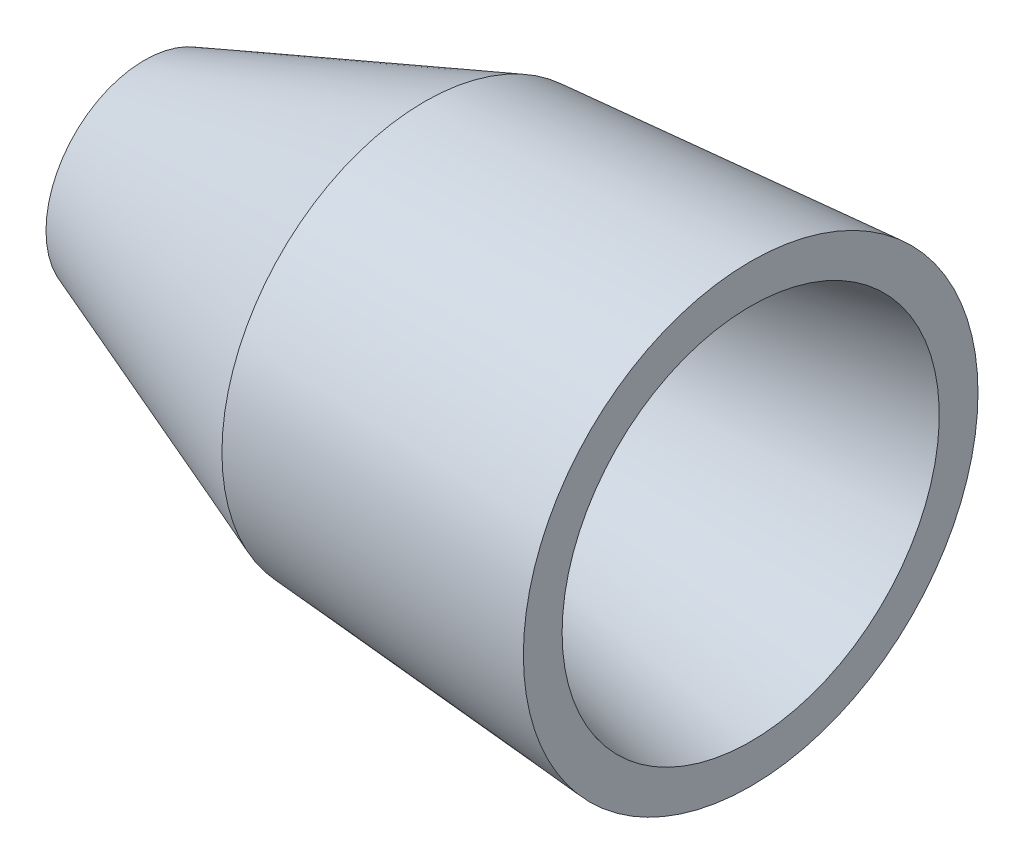
ISO-10303-21;
HEADER;
FILE_DESCRIPTION(('STEP AP214'),'2;1');
FILE_NAME('part.step','',(''),(''),'','','');
FILE_SCHEMA(('AUTOMOTIVE_DESIGN { 1 0 10303 214 1 1 1 1 }'));
ENDSEC;
DATA;
#1=APPLICATION_CONTEXT('core data for automotive mechanical design processes');
#2=APPLICATION_PROTOCOL_DEFINITION('international standard','automotive_design',2000,#1);
#3=PRODUCT_CONTEXT('',#1,'mechanical');
#4=PRODUCT('Part','Part','',(#3));
#5=PRODUCT_RELATED_PRODUCT_CATEGORY('part','',(#4));
#6=PRODUCT_DEFINITION_FORMATION('','',#4);
#7=PRODUCT_DEFINITION_CONTEXT('part definition',#1,'design');
#8=PRODUCT_DEFINITION('design','',#6,#7);
#9=PRODUCT_DEFINITION_SHAPE('','',#8);
#10=(LENGTH_UNIT() NAMED_UNIT(*) SI_UNIT(.MILLI.,.METRE.));
#11=(NAMED_UNIT(*) PLANE_ANGLE_UNIT() SI_UNIT($,.RADIAN.));
#12=(NAMED_UNIT(*) SI_UNIT($,.STERADIAN.) SOLID_ANGLE_UNIT());
#13=UNCERTAINTY_MEASURE_WITH_UNIT(LENGTH_MEASURE(1.E-05),#10,'distance_accuracy_value','');
#14=(GEOMETRIC_REPRESENTATION_CONTEXT(3) GLOBAL_UNCERTAINTY_ASSIGNED_CONTEXT((#13)) GLOBAL_UNIT_ASSIGNED_CONTEXT((#10,
#11,#12)) REPRESENTATION_CONTEXT('',''));
#15=CARTESIAN_POINT('',(0.,0.,0.));
#16=DIRECTION('',(0.,0.,1.));
#17=DIRECTION('',(1.,0.,0.));
#18=AXIS2_PLACEMENT_3D('',#15,#16,#17);
#19=CARTESIAN_POINT('',(0.,0.,0.));
#20=DIRECTION('',(1.,0.,0.));
#21=DIRECTION('',(0.,0.,-1.));
#22=AXIS2_PLACEMENT_3D('',#19,#20,#21);
#23=CONICAL_SURFACE('',#22,7.8883558173519,0.209385392953495);
#24=CARTESIAN_POINT('',(80.,0.,0.));
#25=DIRECTION('',(-1.,0.,0.));
#26=DIRECTION('',(0.,0.,1.));
#27=AXIS2_PLACEMENT_3D('',#24,#25,#26);
#28=CIRCLE('',#27,24.8883558173519);
#29=CARTESIAN_POINT('',(80.,0.,24.8883558173519));
#30=VERTEX_POINT('',#29);
#31=EDGE_CURVE('E55',#30,#30,#28,.T.);
#32=ORIENTED_EDGE('',*,*,#31,.F.);
#33=EDGE_LOOP('',(#32));
#34=FACE_BOUND('',#33,.T.);
#35=CARTESIAN_POINT('',(10.,0.,0.));
#36=DIRECTION('',(-1.,0.,0.));
#37=DIRECTION('',(0.,0.,1.));
#38=AXIS2_PLACEMENT_3D('',#35,#36,#37);
#39=CIRCLE('',#38,10.0133558173519);
#40=CARTESIAN_POINT('',(10.,0.,10.0133558173519));
#41=VERTEX_POINT('',#40);
#42=EDGE_CURVE('E10',#41,#41,#39,.F.);
#43=ORIENTED_EDGE('',*,*,#42,.F.);
#44=EDGE_LOOP('',(#43));
#45=FACE_BOUND('',#44,.T.);
#46=ADVANCED_FACE('F40',(#34,#45),#23,.F.);
#47=CARTESIAN_POINT('',(80.,0.,0.));
#48=DIRECTION('',(1.,0.,0.));
#49=DIRECTION('',(0.,0.,-1.));
#50=AXIS2_PLACEMENT_3D('',#47,#48,#49);
#51=CONICAL_SURFACE('',#50,30.,0.07540426942151);
#52=CARTESIAN_POINT('',(36.9685397326132,0.,0.));
#53=DIRECTION('',(-1.,0.,0.));
#54=DIRECTION('',(0.,0.,1.));
#55=AXIS2_PLACEMENT_3D('',#52,#53,#54);
#56=CIRCLE('',#55,26.7490804760661);
#57=CARTESIAN_POINT('',(36.9685397326132,0.,26.7490804760661));
#58=VERTEX_POINT('',#57);
#59=EDGE_CURVE('E42',#58,#58,#56,.T.);
#60=ORIENTED_EDGE('',*,*,#59,.F.);
#61=EDGE_LOOP('',(#60));
#62=FACE_BOUND('',#61,.T.);
#63=CARTESIAN_POINT('',(80.,0.,0.));
#64=DIRECTION('',(-1.,0.,0.));
#65=DIRECTION('',(0.,0.,1.));
#66=AXIS2_PLACEMENT_3D('',#63,#64,#65);
#67=CIRCLE('',#66,30.);
#68=CARTESIAN_POINT('',(80.,0.,30.));
#69=VERTEX_POINT('',#68);
#70=EDGE_CURVE('E60',#69,#69,#67,.T.);
#71=ORIENTED_EDGE('',*,*,#70,.T.);
#72=EDGE_LOOP('',(#71));
#73=FACE_BOUND('',#72,.T.);
#74=ADVANCED_FACE('F39',(#62,#73),#51,.T.);
#75=CARTESIAN_POINT('',(36.9685397326132,0.,0.));
#76=DIRECTION('',(1.,0.,0.));
#77=DIRECTION('',(0.,0.,-1.));
#78=AXIS2_PLACEMENT_3D('',#75,#76,#77);
#79=CONICAL_SURFACE('',#78,26.7490804760661,0.356061515415133);
#80=CARTESIAN_POINT('',(0.,0.,0.));
#81=DIRECTION('',(-1.,0.,0.));
#82=DIRECTION('',(0.,0.,1.));
#83=AXIS2_PLACEMENT_3D('',#80,#81,#82);
#84=CIRCLE('',#83,13.);
#85=CARTESIAN_POINT('',(0.,0.,13.));
#86=VERTEX_POINT('',#85);
#87=EDGE_CURVE('E48',#86,#86,#84,.T.);
#88=ORIENTED_EDGE('',*,*,#87,.F.);
#89=EDGE_LOOP('',(#88));
#90=FACE_BOUND('',#89,.T.);
#91=ORIENTED_EDGE('',*,*,#59,.T.);
#92=EDGE_LOOP('',(#91));
#93=FACE_BOUND('',#92,.T.);
#94=ADVANCED_FACE('F97',(#90,#93),#79,.T.);
#95=CARTESIAN_POINT('',(0.,13.,0.));
#96=DIRECTION('',(1.,0.,0.));
#97=DIRECTION('',(0.,0.,-1.));
#98=AXIS2_PLACEMENT_3D('',#95,#96,#97);
#99=PLANE('',#98);
#100=CARTESIAN_POINT('',(0.,8.,0.));
#101=DIRECTION('',(-1.,0.,0.));
#102=DIRECTION('',(0.,0.,1.));
#103=AXIS2_PLACEMENT_3D('',#100,#101,#102);
#104=CIRCLE('',#103,1.5);
#105=CARTESIAN_POINT('',(0.,8.,1.5));
#106=VERTEX_POINT('',#105);
#107=EDGE_CURVE('E80',#106,#106,#104,.T.);
#108=ORIENTED_EDGE('',*,*,#107,.F.);
#109=EDGE_LOOP('',(#108));
#110=FACE_BOUND('',#109,.T.);
#111=CARTESIAN_POINT('',(0.,-8.,0.));
#112=DIRECTION('',(-1.,0.,0.));
#113=DIRECTION('',(0.,0.,1.));
#114=AXIS2_PLACEMENT_3D('',#111,#112,#113);
#115=CIRCLE('',#114,1.5);
#116=CARTESIAN_POINT('',(0.,-8.,1.5));
#117=VERTEX_POINT('',#116);
#118=EDGE_CURVE('E78',#117,#117,#115,.T.);
#119=ORIENTED_EDGE('',*,*,#118,.F.);
#120=EDGE_LOOP('',(#119));
#121=FACE_BOUND('',#120,.T.);
#122=CARTESIAN_POINT('',(0.,0.,8.));
#123=DIRECTION('',(-1.,0.,0.));
#124=DIRECTION('',(0.,0.,1.));
#125=AXIS2_PLACEMENT_3D('',#122,#123,#124);
#126=CIRCLE('',#125,1.5);
#127=CARTESIAN_POINT('',(0.,0.,9.5));
#128=VERTEX_POINT('',#127);
#129=EDGE_CURVE('E67',#128,#128,#126,.T.);
#130=ORIENTED_EDGE('',*,*,#129,.F.);
#131=EDGE_LOOP('',(#130));
#132=FACE_BOUND('',#131,.T.);
#133=CARTESIAN_POINT('',(0.,0.,-8.));
#134=DIRECTION('',(-1.,0.,0.));
#135=DIRECTION('',(0.,0.,1.));
#136=AXIS2_PLACEMENT_3D('',#133,#134,#135);
#137=CIRCLE('',#136,1.5);
#138=CARTESIAN_POINT('',(0.,0.,-6.5));
#139=VERTEX_POINT('',#138);
#140=EDGE_CURVE('E65',#139,#139,#137,.T.);
#141=ORIENTED_EDGE('',*,*,#140,.F.);
#142=EDGE_LOOP('',(#141));
#143=FACE_BOUND('',#142,.T.);
#144=ORIENTED_EDGE('',*,*,#87,.T.);
#145=EDGE_LOOP('',(#144));
#146=FACE_BOUND('',#145,.T.);
#147=ADVANCED_FACE('F92',(#110,#121,#132,#143,#146),#99,.F.);
#148=CARTESIAN_POINT('',(80.,24.8883558173519,0.));
#149=DIRECTION('',(-1.,0.,0.));
#150=DIRECTION('',(0.,0.,1.));
#151=AXIS2_PLACEMENT_3D('',#148,#149,#150);
#152=PLANE('',#151);
#153=ORIENTED_EDGE('',*,*,#70,.F.);
#154=EDGE_LOOP('',(#153));
#155=FACE_BOUND('',#154,.T.);
#156=ORIENTED_EDGE('',*,*,#31,.T.);
#157=EDGE_LOOP('',(#156));
#158=FACE_BOUND('',#157,.T.);
#159=ADVANCED_FACE('F98',(#155,#158),#152,.F.);
#160=CARTESIAN_POINT('',(10.,0.,0.));
#161=DIRECTION('',(-1.,0.,0.));
#162=DIRECTION('',(0.,0.,1.));
#163=AXIS2_PLACEMENT_3D('',#160,#161,#162);
#164=PLANE('',#163);
#165=CARTESIAN_POINT('',(10.,8.,0.));
#166=DIRECTION('',(-1.,0.,0.));
#167=DIRECTION('',(0.,0.,1.));
#168=AXIS2_PLACEMENT_3D('',#165,#166,#167);
#169=CIRCLE('',#168,1.5);
#170=CARTESIAN_POINT('',(10.,8.,1.5));
#171=VERTEX_POINT('',#170);
#172=EDGE_CURVE('E58',#171,#171,#169,.T.);
#173=ORIENTED_EDGE('',*,*,#172,.T.);
#174=EDGE_LOOP('',(#173));
#175=FACE_BOUND('',#174,.T.);
#176=CARTESIAN_POINT('',(10.,-8.,0.));
#177=DIRECTION('',(-1.,0.,0.));
#178=DIRECTION('',(0.,0.,1.));
#179=AXIS2_PLACEMENT_3D('',#176,#177,#178);
#180=CIRCLE('',#179,1.5);
#181=CARTESIAN_POINT('',(10.,-8.,1.5));
#182=VERTEX_POINT('',#181);
#183=EDGE_CURVE('E71',#182,#182,#180,.T.);
#184=ORIENTED_EDGE('',*,*,#183,.T.);
#185=EDGE_LOOP('',(#184));
#186=FACE_BOUND('',#185,.T.);
#187=CARTESIAN_POINT('',(10.,0.,8.));
#188=DIRECTION('',(-1.,0.,0.));
#189=DIRECTION('',(0.,0.,1.));
#190=AXIS2_PLACEMENT_3D('',#187,#188,#189);
#191=CIRCLE('',#190,1.5);
#192=CARTESIAN_POINT('',(10.,0.,9.5));
#193=VERTEX_POINT('',#192);
#194=EDGE_CURVE('E70',#193,#193,#191,.T.);
#195=ORIENTED_EDGE('',*,*,#194,.T.);
#196=EDGE_LOOP('',(#195));
#197=FACE_BOUND('',#196,.T.);
#198=CARTESIAN_POINT('',(10.,0.,-8.));
#199=DIRECTION('',(-1.,0.,0.));
#200=DIRECTION('',(0.,0.,1.));
#201=AXIS2_PLACEMENT_3D('',#198,#199,#200);
#202=CIRCLE('',#201,1.5);
#203=CARTESIAN_POINT('',(10.,0.,-6.5));
#204=VERTEX_POINT('',#203);
#205=EDGE_CURVE('E63',#204,#204,#202,.T.);
#206=ORIENTED_EDGE('',*,*,#205,.T.);
#207=EDGE_LOOP('',(#206));
#208=FACE_BOUND('',#207,.T.);
#209=ORIENTED_EDGE('',*,*,#42,.T.);
#210=EDGE_LOOP('',(#209));
#211=FACE_BOUND('',#210,.T.);
#212=ADVANCED_FACE('F82',(#175,#186,#197,#208,#211),#164,.F.);
#213=CARTESIAN_POINT('',(10.,0.,-8.));
#214=DIRECTION('',(-1.,0.,0.));
#215=DIRECTION('',(0.,0.,1.));
#216=AXIS2_PLACEMENT_3D('',#213,#214,#215);
#217=CYLINDRICAL_SURFACE('',#216,1.5);
#218=ORIENTED_EDGE('',*,*,#205,.F.);
#219=EDGE_LOOP('',(#218));
#220=FACE_BOUND('',#219,.T.);
#221=ORIENTED_EDGE('',*,*,#140,.T.);
#222=EDGE_LOOP('',(#221));
#223=FACE_BOUND('',#222,.T.);
#224=ADVANCED_FACE('F130',(#220,#223),#217,.F.);
#225=CARTESIAN_POINT('',(10.,0.,8.));
#226=DIRECTION('',(-1.,0.,0.));
#227=DIRECTION('',(0.,0.,1.));
#228=AXIS2_PLACEMENT_3D('',#225,#226,#227);
#229=CYLINDRICAL_SURFACE('',#228,1.5);
#230=ORIENTED_EDGE('',*,*,#194,.F.);
#231=EDGE_LOOP('',(#230));
#232=FACE_BOUND('',#231,.T.);
#233=ORIENTED_EDGE('',*,*,#129,.T.);
#234=EDGE_LOOP('',(#233));
#235=FACE_BOUND('',#234,.T.);
#236=ADVANCED_FACE('F128',(#232,#235),#229,.F.);
#237=CARTESIAN_POINT('',(10.,-8.,0.));
#238=DIRECTION('',(-1.,0.,0.));
#239=DIRECTION('',(0.,0.,1.));
#240=AXIS2_PLACEMENT_3D('',#237,#238,#239);
#241=CYLINDRICAL_SURFACE('',#240,1.5);
#242=ORIENTED_EDGE('',*,*,#183,.F.);
#243=EDGE_LOOP('',(#242));
#244=FACE_BOUND('',#243,.T.);
#245=ORIENTED_EDGE('',*,*,#118,.T.);
#246=EDGE_LOOP('',(#245));
#247=FACE_BOUND('',#246,.T.);
#248=ADVANCED_FACE('F93',(#244,#247),#241,.F.);
#249=CARTESIAN_POINT('',(10.,8.,0.));
#250=DIRECTION('',(-1.,0.,0.));
#251=DIRECTION('',(0.,0.,1.));
#252=AXIS2_PLACEMENT_3D('',#249,#250,#251);
#253=CYLINDRICAL_SURFACE('',#252,1.5);
#254=ORIENTED_EDGE('',*,*,#172,.F.);
#255=EDGE_LOOP('',(#254));
#256=FACE_BOUND('',#255,.T.);
#257=ORIENTED_EDGE('',*,*,#107,.T.);
#258=EDGE_LOOP('',(#257));
#259=FACE_BOUND('',#258,.T.);
#260=ADVANCED_FACE('F86',(#256,#259),#253,.F.);
#261=CLOSED_SHELL('',(#46,#74,#94,#147,#159,#212,#224,#236,#248,#260));
#262=MANIFOLD_SOLID_BREP('B2',#261);
#263=ADVANCED_BREP_SHAPE_REPRESENTATION('',(#18,#262),#14);
#264=SHAPE_DEFINITION_REPRESENTATION(#9,#263);
ENDSEC;
END-ISO-10303-21;
